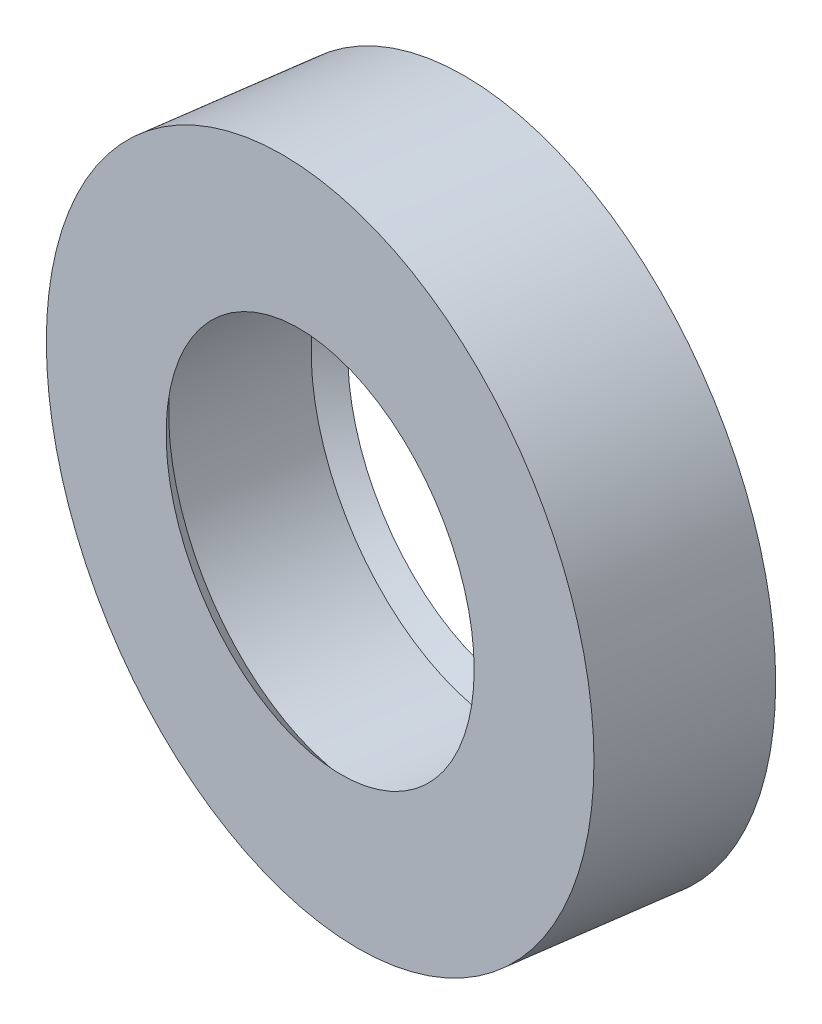
ISO-10303-21;
HEADER;
FILE_DESCRIPTION(('STEP AP214'),'2;1');
FILE_NAME('part.step','',(''),(''),'','','');
FILE_SCHEMA(('AUTOMOTIVE_DESIGN { 1 0 10303 214 1 1 1 1 }'));
ENDSEC;
DATA;
#1=APPLICATION_CONTEXT('core data for automotive mechanical design processes');
#2=APPLICATION_PROTOCOL_DEFINITION('international standard','automotive_design',2000,#1);
#3=PRODUCT_CONTEXT('',#1,'mechanical');
#4=PRODUCT('Part','Part','',(#3));
#5=PRODUCT_RELATED_PRODUCT_CATEGORY('part','',(#4));
#6=PRODUCT_DEFINITION_FORMATION('','',#4);
#7=PRODUCT_DEFINITION_CONTEXT('part definition',#1,'design');
#8=PRODUCT_DEFINITION('design','',#6,#7);
#9=PRODUCT_DEFINITION_SHAPE('','',#8);
#10=(LENGTH_UNIT() NAMED_UNIT(*) SI_UNIT(.MILLI.,.METRE.));
#11=(NAMED_UNIT(*) PLANE_ANGLE_UNIT() SI_UNIT($,.RADIAN.));
#12=(NAMED_UNIT(*) SI_UNIT($,.STERADIAN.) SOLID_ANGLE_UNIT());
#13=UNCERTAINTY_MEASURE_WITH_UNIT(LENGTH_MEASURE(1.E-05),#10,'distance_accuracy_value','');
#14=(GEOMETRIC_REPRESENTATION_CONTEXT(3) GLOBAL_UNCERTAINTY_ASSIGNED_CONTEXT((#13)) GLOBAL_UNIT_ASSIGNED_CONTEXT((#10,
#11,#12)) REPRESENTATION_CONTEXT('',''));
#15=CARTESIAN_POINT('',(0.,0.,0.));
#16=DIRECTION('',(0.,0.,1.));
#17=DIRECTION('',(1.,0.,0.));
#18=AXIS2_PLACEMENT_3D('',#15,#16,#17);
#19=CARTESIAN_POINT('',(-14.3751763426547,3.98458806751927,11.4689901185602));
#20=DIRECTION('',(0.139254831399095,0.,-0.990256578838035));
#21=DIRECTION('',(-0.990256578838035,0.,-0.139254831399095));
#22=AXIS2_PLACEMENT_3D('',#19,#20,#21);
#23=PLANE('',#22);
#24=CARTESIAN_POINT('',(-17.2846302114716,-5.33418386342075,11.0598481682579));
#25=DIRECTION('',(-0.139254831399095,0.,0.990256578838035));
#26=DIRECTION('',(0.990256578838035,0.,0.139254831399095));
#27=AXIS2_PLACEMENT_3D('',#24,#25,#26);
#28=CIRCLE('',#27,7.14375000000002);
#29=CARTESIAN_POINT('',(-10.2104847763974,-5.33418386342075,12.0546498700651));
#30=VERTEX_POINT('',#29);
#31=EDGE_CURVE('E10',#30,#30,#28,.T.);
#32=ORIENTED_EDGE('',*,*,#31,.F.);
#33=EDGE_LOOP('',(#32));
#34=FACE_BOUND('',#33,.T.);
#35=CARTESIAN_POINT('',(-17.2846302114716,-5.33418386342075,11.0598481682579));
#36=DIRECTION('',(-0.139254831399095,0.,0.990256578838035));
#37=DIRECTION('',(0.990256578838035,0.,0.139254831399095));
#38=AXIS2_PLACEMENT_3D('',#35,#36,#37);
#39=CIRCLE('',#38,12.7);
#40=CARTESIAN_POINT('',(-4.7083716602286,-5.33418386342075,12.8283845270264));
#41=VERTEX_POINT('',#40);
#42=EDGE_CURVE('E52',#41,#41,#39,.T.);
#43=ORIENTED_EDGE('',*,*,#42,.T.);
#44=EDGE_LOOP('',(#43));
#45=FACE_BOUND('',#44,.T.);
#46=ADVANCED_FACE('F30',(#34,#45),#23,.F.);
#47=CARTESIAN_POINT('',(-17.2846302114716,-5.33418386342075,11.0598481682579));
#48=DIRECTION('',(0.139254831399095,0.,-0.990256578838035));
#49=DIRECTION('',(-0.990256578838035,0.,-0.139254831399095));
#50=AXIS2_PLACEMENT_3D('',#47,#48,#49);
#51=CONICAL_SURFACE('',#50,7.14375000000002,0.85823048213964);
#52=CARTESIAN_POINT('',(-17.1891292480981,-5.33418386342075,10.3807302064907));
#53=DIRECTION('',(-0.139254831399095,0.,0.990256578838035));
#54=DIRECTION('',(0.990256578838035,0.,0.139254831399095));
#55=AXIS2_PLACEMENT_3D('',#52,#53,#54);
#56=CIRCLE('',#55,7.9375);
#57=CARTESIAN_POINT('',(-9.32896765357124,-5.33418386342075,11.486065430721));
#58=VERTEX_POINT('',#57);
#59=EDGE_CURVE('E36',#58,#58,#56,.T.);
#60=ORIENTED_EDGE('',*,*,#59,.F.);
#61=EDGE_LOOP('',(#60));
#62=FACE_BOUND('',#61,.T.);
#63=ORIENTED_EDGE('',*,*,#31,.T.);
#64=EDGE_LOOP('',(#63));
#65=FACE_BOUND('',#64,.T.);
#66=ADVANCED_FACE('F69',(#62,#65),#51,.F.);
#67=CARTESIAN_POINT('',(-20.4143711217794,-5.33418386342076,33.3157835304472));
#68=DIRECTION('',(-0.139254831399095,0.,0.990256578838035));
#69=DIRECTION('',(0.990256578838035,0.,0.139254831399095));
#70=AXIS2_PLACEMENT_3D('',#67,#68,#69);
#71=CYLINDRICAL_SURFACE('',#70,7.9375);
#72=CARTESIAN_POINT('',(-16.4958629954609,-5.33418386342075,5.45083685440346));
#73=DIRECTION('',(-0.139254831399095,0.,0.990256578838035));
#74=DIRECTION('',(0.990256578838035,0.,0.139254831399095));
#75=AXIS2_PLACEMENT_3D('',#72,#73,#74);
#76=CIRCLE('',#75,7.93750000000001);
#77=CARTESIAN_POINT('',(-8.63570140093398,-5.33418386342075,6.55617207863378));
#78=VERTEX_POINT('',#77);
#79=EDGE_CURVE('E40',#78,#78,#76,.T.);
#80=ORIENTED_EDGE('',*,*,#79,.F.);
#81=EDGE_LOOP('',(#80));
#82=FACE_BOUND('',#81,.T.);
#83=ORIENTED_EDGE('',*,*,#59,.T.);
#84=EDGE_LOOP('',(#83));
#85=FACE_BOUND('',#84,.T.);
#86=ADVANCED_FACE('F74',(#82,#85),#71,.F.);
#87=CARTESIAN_POINT('',(-16.4958629954609,-5.33418386342075,5.45083685440346));
#88=DIRECTION('',(-0.139254831399095,0.,0.990256578838035));
#89=DIRECTION('',(0.990256578838035,0.,0.139254831399095));
#90=AXIS2_PLACEMENT_3D('',#87,#88,#89);
#91=CONICAL_SURFACE('',#90,7.93750000000001,0.858230482139638);
#92=CARTESIAN_POINT('',(-16.4003620320874,-5.33418386342075,4.77171889263633));
#93=DIRECTION('',(-0.139254831399095,0.,0.990256578838035));
#94=DIRECTION('',(0.990256578838035,0.,0.139254831399095));
#95=AXIS2_PLACEMENT_3D('',#92,#93,#94);
#96=CIRCLE('',#95,7.14375000000002);
#97=CARTESIAN_POINT('',(-9.32621659701316,-5.33418386342075,5.76652059444362));
#98=VERTEX_POINT('',#97);
#99=EDGE_CURVE('E44',#98,#98,#96,.T.);
#100=ORIENTED_EDGE('',*,*,#99,.F.);
#101=EDGE_LOOP('',(#100));
#102=FACE_BOUND('',#101,.T.);
#103=ORIENTED_EDGE('',*,*,#79,.T.);
#104=EDGE_LOOP('',(#103));
#105=FACE_BOUND('',#104,.T.);
#106=ADVANCED_FACE('F65',(#102,#105),#91,.F.);
#107=CARTESIAN_POINT('',(-13.4909081632704,3.98458806751921,5.18086084293872));
#108=DIRECTION('',(0.139254831399095,0.,-0.990256578838035));
#109=DIRECTION('',(-0.990256578838035,0.,-0.139254831399095));
#110=AXIS2_PLACEMENT_3D('',#107,#108,#109);
#111=PLANE('',#110);
#112=ORIENTED_EDGE('',*,*,#99,.T.);
#113=EDGE_LOOP('',(#112));
#114=FACE_BOUND('',#113,.T.);
#115=CARTESIAN_POINT('',(-16.4003620320874,-5.33418386342075,4.77171889263633));
#116=DIRECTION('',(-0.139254831399095,0.,0.990256578838035));
#117=DIRECTION('',(0.990256578838035,0.,0.139254831399095));
#118=AXIS2_PLACEMENT_3D('',#115,#116,#117);
#119=CIRCLE('',#118,12.7);
#120=CARTESIAN_POINT('',(-3.82410348084434,-5.33418386342075,6.54025525140484));
#121=VERTEX_POINT('',#120);
#122=EDGE_CURVE('E49',#121,#121,#119,.T.);
#123=ORIENTED_EDGE('',*,*,#122,.F.);
#124=EDGE_LOOP('',(#123));
#125=FACE_BOUND('',#124,.T.);
#126=ADVANCED_FACE('F59',(#114,#125),#111,.T.);
#127=CARTESIAN_POINT('',(-20.4143711217794,-5.33418386342076,33.3157835304472));
#128=DIRECTION('',(-0.139254831399095,0.,0.990256578838035));
#129=DIRECTION('',(0.990256578838035,0.,0.139254831399095));
#130=AXIS2_PLACEMENT_3D('',#127,#128,#129);
#131=CYLINDRICAL_SURFACE('',#130,12.7);
#132=ORIENTED_EDGE('',*,*,#122,.T.);
#133=EDGE_LOOP('',(#132));
#134=FACE_BOUND('',#133,.T.);
#135=ORIENTED_EDGE('',*,*,#42,.F.);
#136=EDGE_LOOP('',(#135));
#137=FACE_BOUND('',#136,.T.);
#138=ADVANCED_FACE('F57',(#134,#137),#131,.T.);
#139=CLOSED_SHELL('',(#46,#66,#86,#106,#126,#138));
#140=MANIFOLD_SOLID_BREP('B2',#139);
#141=ADVANCED_BREP_SHAPE_REPRESENTATION('',(#18,#140),#14);
#142=SHAPE_DEFINITION_REPRESENTATION(#9,#141);
ENDSEC;
END-ISO-10303-21;
